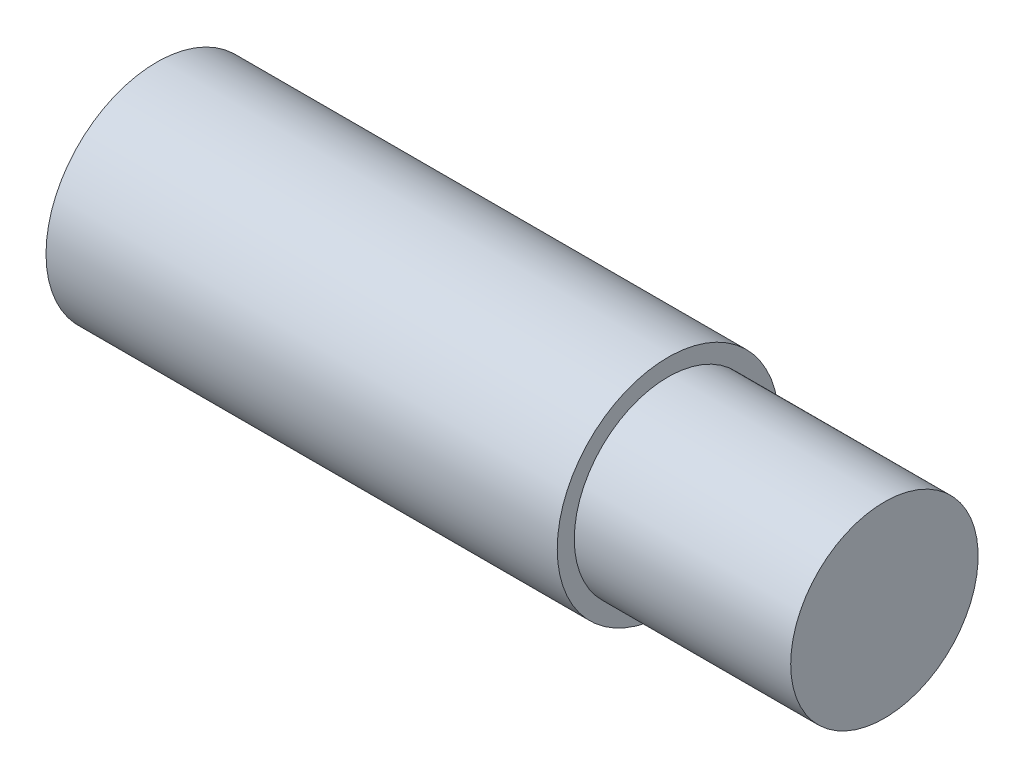
ISO-10303-21;
HEADER;
FILE_DESCRIPTION(('STEP AP214'),'2;1');
FILE_NAME('part.step','',(''),(''),'','','');
FILE_SCHEMA(('AUTOMOTIVE_DESIGN { 1 0 10303 214 1 1 1 1 }'));
ENDSEC;
DATA;
#1=APPLICATION_CONTEXT('core data for automotive mechanical design processes');
#2=APPLICATION_PROTOCOL_DEFINITION('international standard','automotive_design',2000,#1);
#3=PRODUCT_CONTEXT('',#1,'mechanical');
#4=PRODUCT('Part','Part','',(#3));
#5=PRODUCT_RELATED_PRODUCT_CATEGORY('part','',(#4));
#6=PRODUCT_DEFINITION_FORMATION('','',#4);
#7=PRODUCT_DEFINITION_CONTEXT('part definition',#1,'design');
#8=PRODUCT_DEFINITION('design','',#6,#7);
#9=PRODUCT_DEFINITION_SHAPE('','',#8);
#10=(LENGTH_UNIT() NAMED_UNIT(*) SI_UNIT(.MILLI.,.METRE.));
#11=(NAMED_UNIT(*) PLANE_ANGLE_UNIT() SI_UNIT($,.RADIAN.));
#12=(NAMED_UNIT(*) SI_UNIT($,.STERADIAN.) SOLID_ANGLE_UNIT());
#13=UNCERTAINTY_MEASURE_WITH_UNIT(LENGTH_MEASURE(1.E-05),#10,'distance_accuracy_value','');
#14=(GEOMETRIC_REPRESENTATION_CONTEXT(3) GLOBAL_UNCERTAINTY_ASSIGNED_CONTEXT((#13)) GLOBAL_UNIT_ASSIGNED_CONTEXT((#10,
#11,#12)) REPRESENTATION_CONTEXT('',''));
#15=CARTESIAN_POINT('',(0.,0.,0.));
#16=DIRECTION('',(0.,0.,1.));
#17=DIRECTION('',(1.,0.,0.));
#18=AXIS2_PLACEMENT_3D('',#15,#16,#17);
#19=CARTESIAN_POINT('',(12.7,0.,0.));
#20=DIRECTION('',(-1.,0.,0.));
#21=DIRECTION('',(0.,0.,1.));
#22=AXIS2_PLACEMENT_3D('',#19,#20,#21);
#23=PLANE('',#22);
#24=CARTESIAN_POINT('',(12.6999999999999,0.,0.));
#25=DIRECTION('',(-1.,0.,0.));
#26=DIRECTION('',(0.,0.,1.));
#27=AXIS2_PLACEMENT_3D('',#24,#25,#26);
#28=CIRCLE('',#27,5.5);
#29=CARTESIAN_POINT('',(12.6999999999999,0.,5.5));
#30=VERTEX_POINT('',#29);
#31=EDGE_CURVE('E10',#30,#30,#28,.T.);
#32=ORIENTED_EDGE('',*,*,#31,.F.);
#33=EDGE_LOOP('',(#32));
#34=FACE_BOUND('',#33,.T.);
#35=ADVANCED_FACE('F39',(#34),#23,.F.);
#36=CARTESIAN_POINT('',(-1000.,0.,0.));
#37=DIRECTION('',(-1.,0.,0.));
#38=DIRECTION('',(0.,0.,1.));
#39=AXIS2_PLACEMENT_3D('',#36,#37,#38);
#40=CYLINDRICAL_SURFACE('',#39,5.5);
#41=CARTESIAN_POINT('',(0.,0.,0.));
#42=DIRECTION('',(-1.,0.,0.));
#43=DIRECTION('',(0.,0.,1.));
#44=AXIS2_PLACEMENT_3D('',#41,#42,#43);
#45=CIRCLE('',#44,5.5);
#46=CARTESIAN_POINT('',(0.,0.,5.5));
#47=VERTEX_POINT('',#46);
#48=EDGE_CURVE('E44',#47,#47,#45,.T.);
#49=ORIENTED_EDGE('',*,*,#48,.F.);
#50=EDGE_LOOP('',(#49));
#51=FACE_BOUND('',#50,.T.);
#52=ORIENTED_EDGE('',*,*,#31,.T.);
#53=EDGE_LOOP('',(#52));
#54=FACE_BOUND('',#53,.T.);
#55=ADVANCED_FACE('F68',(#51,#54),#40,.T.);
#56=CARTESIAN_POINT('',(0.,5.5,0.));
#57=DIRECTION('',(-1.,0.,0.));
#58=DIRECTION('',(0.,0.,1.));
#59=AXIS2_PLACEMENT_3D('',#56,#57,#58);
#60=PLANE('',#59);
#61=CARTESIAN_POINT('',(0.,0.,0.));
#62=DIRECTION('',(-1.,0.,0.));
#63=DIRECTION('',(0.,0.,1.));
#64=AXIS2_PLACEMENT_3D('',#61,#62,#63);
#65=CIRCLE('',#64,6.5);
#66=CARTESIAN_POINT('',(0.,0.,6.5));
#67=VERTEX_POINT('',#66);
#68=EDGE_CURVE('E47',#67,#67,#65,.T.);
#69=ORIENTED_EDGE('',*,*,#68,.F.);
#70=EDGE_LOOP('',(#69));
#71=FACE_BOUND('',#70,.T.);
#72=ORIENTED_EDGE('',*,*,#48,.T.);
#73=EDGE_LOOP('',(#72));
#74=FACE_BOUND('',#73,.T.);
#75=ADVANCED_FACE('F61',(#71,#74),#60,.F.);
#76=CARTESIAN_POINT('',(-1000.,0.,0.));
#77=DIRECTION('',(-1.,0.,0.));
#78=DIRECTION('',(0.,0.,1.));
#79=AXIS2_PLACEMENT_3D('',#76,#77,#78);
#80=CYLINDRICAL_SURFACE('',#79,6.5);
#81=CARTESIAN_POINT('',(-30.,0.,0.));
#82=DIRECTION('',(-1.,0.,0.));
#83=DIRECTION('',(0.,0.,1.));
#84=AXIS2_PLACEMENT_3D('',#81,#82,#83);
#85=CIRCLE('',#84,6.5);
#86=CARTESIAN_POINT('',(-30.,0.,6.5));
#87=VERTEX_POINT('',#86);
#88=EDGE_CURVE('E52',#87,#87,#85,.T.);
#89=ORIENTED_EDGE('',*,*,#88,.F.);
#90=EDGE_LOOP('',(#89));
#91=FACE_BOUND('',#90,.T.);
#92=ORIENTED_EDGE('',*,*,#68,.T.);
#93=EDGE_LOOP('',(#92));
#94=FACE_BOUND('',#93,.T.);
#95=ADVANCED_FACE('F62',(#91,#94),#80,.T.);
#96=CARTESIAN_POINT('',(-30.,6.5,0.));
#97=DIRECTION('',(1.,0.,0.));
#98=DIRECTION('',(0.,0.,-1.));
#99=AXIS2_PLACEMENT_3D('',#96,#97,#98);
#100=PLANE('',#99);
#101=ORIENTED_EDGE('',*,*,#88,.T.);
#102=EDGE_LOOP('',(#101));
#103=FACE_BOUND('',#102,.T.);
#104=ADVANCED_FACE('F56',(#103),#100,.F.);
#105=CLOSED_SHELL('',(#35,#55,#75,#95,#104));
#106=MANIFOLD_SOLID_BREP('B2',#105);
#107=ADVANCED_BREP_SHAPE_REPRESENTATION('',(#18,#106),#14);
#108=SHAPE_DEFINITION_REPRESENTATION(#9,#107);
ENDSEC;
END-ISO-10303-21;
